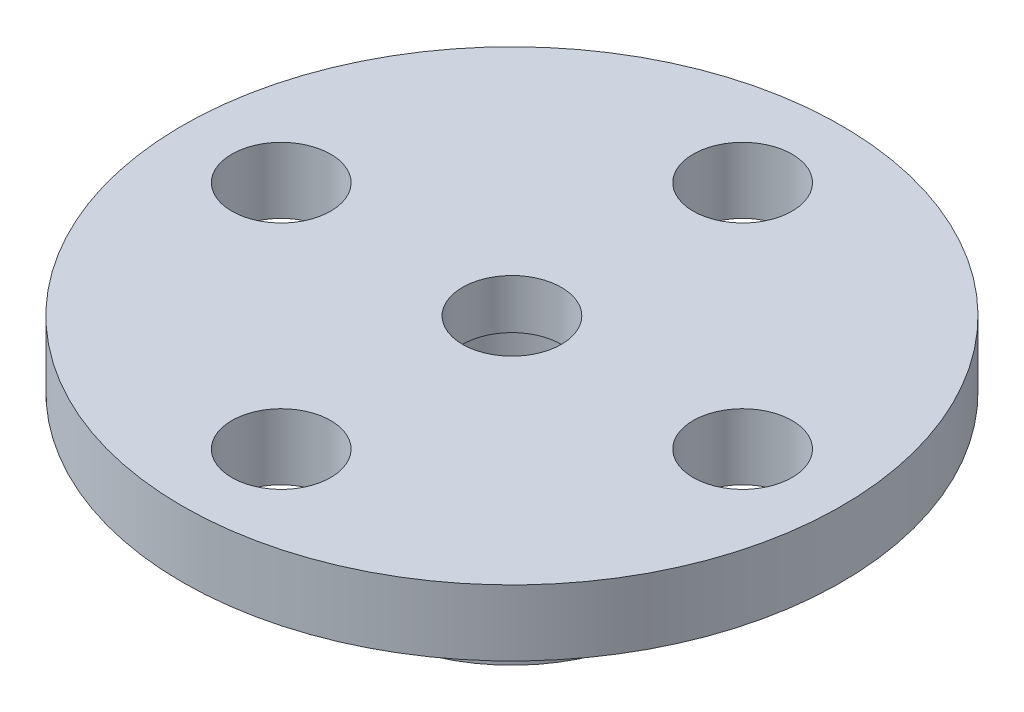
ISO-10303-21;
HEADER;
FILE_DESCRIPTION(('STEP AP214'),'2;1');
FILE_NAME('part.step','',(''),(''),'','','');
FILE_SCHEMA(('AUTOMOTIVE_DESIGN { 1 0 10303 214 1 1 1 1 }'));
ENDSEC;
DATA;
#1=APPLICATION_CONTEXT('core data for automotive mechanical design processes');
#2=APPLICATION_PROTOCOL_DEFINITION('international standard','automotive_design',2000,#1);
#3=PRODUCT_CONTEXT('',#1,'mechanical');
#4=PRODUCT('Part','Part','',(#3));
#5=PRODUCT_RELATED_PRODUCT_CATEGORY('part','',(#4));
#6=PRODUCT_DEFINITION_FORMATION('','',#4);
#7=PRODUCT_DEFINITION_CONTEXT('part definition',#1,'design');
#8=PRODUCT_DEFINITION('design','',#6,#7);
#9=PRODUCT_DEFINITION_SHAPE('','',#8);
#10=(LENGTH_UNIT() NAMED_UNIT(*) SI_UNIT(.MILLI.,.METRE.));
#11=(NAMED_UNIT(*) PLANE_ANGLE_UNIT() SI_UNIT($,.RADIAN.));
#12=(NAMED_UNIT(*) SI_UNIT($,.STERADIAN.) SOLID_ANGLE_UNIT());
#13=UNCERTAINTY_MEASURE_WITH_UNIT(LENGTH_MEASURE(1.E-05),#10,'distance_accuracy_value','');
#14=(GEOMETRIC_REPRESENTATION_CONTEXT(3) GLOBAL_UNCERTAINTY_ASSIGNED_CONTEXT((#13)) GLOBAL_UNIT_ASSIGNED_CONTEXT((#10,
#11,#12)) REPRESENTATION_CONTEXT('',''));
#15=CARTESIAN_POINT('',(0.,0.,0.));
#16=DIRECTION('',(0.,0.,1.));
#17=DIRECTION('',(1.,0.,0.));
#18=AXIS2_PLACEMENT_3D('',#15,#16,#17);
#19=CARTESIAN_POINT('',(0.,2.,0.));
#20=DIRECTION('',(0.,1.,0.));
#21=DIRECTION('',(0.,0.,1.));
#22=AXIS2_PLACEMENT_3D('',#19,#20,#21);
#23=PLANE('',#22);
#24=CARTESIAN_POINT('',(0.,2.,0.));
#25=DIRECTION('',(0.,1.,0.));
#26=DIRECTION('',(0.,0.,1.));
#27=AXIS2_PLACEMENT_3D('',#24,#25,#26);
#28=CIRCLE('',#27,1.5);
#29=CARTESIAN_POINT('',(0.,2.,1.5));
#30=VERTEX_POINT('',#29);
#31=EDGE_CURVE('E76',#30,#30,#28,.T.);
#32=ORIENTED_EDGE('',*,*,#31,.F.);
#33=EDGE_LOOP('',(#32));
#34=FACE_BOUND('',#33,.T.);
#35=CARTESIAN_POINT('',(0.,2.,7.));
#36=DIRECTION('',(0.,1.,0.));
#37=DIRECTION('',(0.,0.,1.));
#38=AXIS2_PLACEMENT_3D('',#35,#36,#37);
#39=CIRCLE('',#38,1.50000000000005);
#40=CARTESIAN_POINT('',(0.,2.,8.50000000000005));
#41=VERTEX_POINT('',#40);
#42=EDGE_CURVE('E58',#41,#41,#39,.T.);
#43=ORIENTED_EDGE('',*,*,#42,.F.);
#44=EDGE_LOOP('',(#43));
#45=FACE_BOUND('',#44,.T.);
#46=CARTESIAN_POINT('',(0.,2.,-7.));
#47=DIRECTION('',(0.,1.,0.));
#48=DIRECTION('',(0.,0.,1.));
#49=AXIS2_PLACEMENT_3D('',#46,#47,#48);
#50=CIRCLE('',#49,1.5);
#51=CARTESIAN_POINT('',(0.,2.,-5.5));
#52=VERTEX_POINT('',#51);
#53=EDGE_CURVE('E47',#52,#52,#50,.T.);
#54=ORIENTED_EDGE('',*,*,#53,.F.);
#55=EDGE_LOOP('',(#54));
#56=FACE_BOUND('',#55,.T.);
#57=CARTESIAN_POINT('',(0.,2.,0.));
#58=DIRECTION('',(0.,1.,0.));
#59=DIRECTION('',(0.,0.,1.));
#60=AXIS2_PLACEMENT_3D('',#57,#58,#59);
#61=CIRCLE('',#60,10.);
#62=CARTESIAN_POINT('',(0.,2.,10.));
#63=VERTEX_POINT('',#62);
#64=EDGE_CURVE('E10',#63,#63,#61,.T.);
#65=ORIENTED_EDGE('',*,*,#64,.T.);
#66=EDGE_LOOP('',(#65));
#67=FACE_BOUND('',#66,.T.);
#68=CARTESIAN_POINT('',(7.,2.,0.));
#69=DIRECTION('',(0.,1.,0.));
#70=DIRECTION('',(0.,0.,1.));
#71=AXIS2_PLACEMENT_3D('',#68,#69,#70);
#72=CIRCLE('',#71,1.50000000000002);
#73=CARTESIAN_POINT('',(7.,2.,1.50000000000002));
#74=VERTEX_POINT('',#73);
#75=EDGE_CURVE('E52',#74,#74,#72,.T.);
#76=ORIENTED_EDGE('',*,*,#75,.F.);
#77=EDGE_LOOP('',(#76));
#78=FACE_BOUND('',#77,.T.);
#79=CARTESIAN_POINT('',(-7.,2.,0.));
#80=DIRECTION('',(0.,1.,0.));
#81=DIRECTION('',(0.,0.,1.));
#82=AXIS2_PLACEMENT_3D('',#79,#80,#81);
#83=CIRCLE('',#82,1.50000000000007);
#84=CARTESIAN_POINT('',(-7.,2.,1.50000000000007));
#85=VERTEX_POINT('',#84);
#86=EDGE_CURVE('E64',#85,#85,#83,.T.);
#87=ORIENTED_EDGE('',*,*,#86,.F.);
#88=EDGE_LOOP('',(#87));
#89=FACE_BOUND('',#88,.T.);
#90=ADVANCED_FACE('F34',(#34,#45,#56,#67,#78,#89),#23,.T.);
#91=CARTESIAN_POINT('',(0.,0.,0.));
#92=DIRECTION('',(0.,1.,0.));
#93=DIRECTION('',(0.,0.,1.));
#94=AXIS2_PLACEMENT_3D('',#91,#92,#93);
#95=PLANE('',#94);
#96=CARTESIAN_POINT('',(0.,0.,0.));
#97=DIRECTION('',(0.,1.,0.));
#98=DIRECTION('',(0.,0.,1.));
#99=AXIS2_PLACEMENT_3D('',#96,#97,#98);
#100=CIRCLE('',#99,4.5);
#101=CARTESIAN_POINT('',(0.,0.,4.5));
#102=VERTEX_POINT('',#101);
#103=EDGE_CURVE('E73',#102,#102,#100,.T.);
#104=ORIENTED_EDGE('',*,*,#103,.T.);
#105=EDGE_LOOP('',(#104));
#106=FACE_BOUND('',#105,.T.);
#107=CARTESIAN_POINT('',(0.,0.,0.));
#108=DIRECTION('',(0.,1.,0.));
#109=DIRECTION('',(0.,0.,1.));
#110=AXIS2_PLACEMENT_3D('',#107,#108,#109);
#111=CIRCLE('',#110,10.);
#112=CARTESIAN_POINT('',(0.,0.,10.));
#113=VERTEX_POINT('',#112);
#114=EDGE_CURVE('E42',#113,#113,#111,.T.);
#115=ORIENTED_EDGE('',*,*,#114,.F.);
#116=EDGE_LOOP('',(#115));
#117=FACE_BOUND('',#116,.T.);
#118=CARTESIAN_POINT('',(0.,0.,-7.));
#119=DIRECTION('',(0.,1.,0.));
#120=DIRECTION('',(0.,0.,1.));
#121=AXIS2_PLACEMENT_3D('',#118,#119,#120);
#122=CIRCLE('',#121,1.5);
#123=CARTESIAN_POINT('',(0.,0.,-5.5));
#124=VERTEX_POINT('',#123);
#125=EDGE_CURVE('E49',#124,#124,#122,.T.);
#126=ORIENTED_EDGE('',*,*,#125,.T.);
#127=EDGE_LOOP('',(#126));
#128=FACE_BOUND('',#127,.T.);
#129=CARTESIAN_POINT('',(7.,0.,0.));
#130=DIRECTION('',(0.,1.,0.));
#131=DIRECTION('',(0.,0.,1.));
#132=AXIS2_PLACEMENT_3D('',#129,#130,#131);
#133=CIRCLE('',#132,1.50000000000002);
#134=CARTESIAN_POINT('',(7.,0.,1.50000000000002));
#135=VERTEX_POINT('',#134);
#136=EDGE_CURVE('E55',#135,#135,#133,.T.);
#137=ORIENTED_EDGE('',*,*,#136,.T.);
#138=EDGE_LOOP('',(#137));
#139=FACE_BOUND('',#138,.T.);
#140=CARTESIAN_POINT('',(0.,0.,7.));
#141=DIRECTION('',(0.,1.,0.));
#142=DIRECTION('',(0.,0.,1.));
#143=AXIS2_PLACEMENT_3D('',#140,#141,#142);
#144=CIRCLE('',#143,1.50000000000005);
#145=CARTESIAN_POINT('',(0.,0.,8.50000000000005));
#146=VERTEX_POINT('',#145);
#147=EDGE_CURVE('E61',#146,#146,#144,.T.);
#148=ORIENTED_EDGE('',*,*,#147,.T.);
#149=EDGE_LOOP('',(#148));
#150=FACE_BOUND('',#149,.T.);
#151=CARTESIAN_POINT('',(-7.,0.,0.));
#152=DIRECTION('',(0.,1.,0.));
#153=DIRECTION('',(0.,0.,1.));
#154=AXIS2_PLACEMENT_3D('',#151,#152,#153);
#155=CIRCLE('',#154,1.50000000000007);
#156=CARTESIAN_POINT('',(-7.,0.,1.50000000000007));
#157=VERTEX_POINT('',#156);
#158=EDGE_CURVE('E67',#157,#157,#155,.T.);
#159=ORIENTED_EDGE('',*,*,#158,.T.);
#160=EDGE_LOOP('',(#159));
#161=FACE_BOUND('',#160,.T.);
#162=ADVANCED_FACE('F107',(#106,#117,#128,#139,#150,#161),#95,.F.);
#163=CARTESIAN_POINT('',(0.,2.,0.));
#164=DIRECTION('',(0.,-1.,0.));
#165=DIRECTION('',(0.,0.,-1.));
#166=AXIS2_PLACEMENT_3D('',#163,#164,#165);
#167=CYLINDRICAL_SURFACE('',#166,10.);
#168=ORIENTED_EDGE('',*,*,#64,.F.);
#169=EDGE_LOOP('',(#168));
#170=FACE_BOUND('',#169,.T.);
#171=ORIENTED_EDGE('',*,*,#114,.T.);
#172=EDGE_LOOP('',(#171));
#173=FACE_BOUND('',#172,.T.);
#174=ADVANCED_FACE('F36',(#170,#173),#167,.T.);
#175=CARTESIAN_POINT('',(0.,2.,-7.));
#176=DIRECTION('',(0.,-1.,0.));
#177=DIRECTION('',(0.,0.,-1.));
#178=AXIS2_PLACEMENT_3D('',#175,#176,#177);
#179=CYLINDRICAL_SURFACE('',#178,1.5);
#180=ORIENTED_EDGE('',*,*,#53,.T.);
#181=EDGE_LOOP('',(#180));
#182=FACE_BOUND('',#181,.T.);
#183=ORIENTED_EDGE('',*,*,#125,.F.);
#184=EDGE_LOOP('',(#183));
#185=FACE_BOUND('',#184,.T.);
#186=ADVANCED_FACE('F117',(#182,#185),#179,.F.);
#187=CARTESIAN_POINT('',(7.,2.,0.));
#188=DIRECTION('',(0.,-1.,0.));
#189=DIRECTION('',(0.,0.,-1.));
#190=AXIS2_PLACEMENT_3D('',#187,#188,#189);
#191=CYLINDRICAL_SURFACE('',#190,1.50000000000002);
#192=ORIENTED_EDGE('',*,*,#75,.T.);
#193=EDGE_LOOP('',(#192));
#194=FACE_BOUND('',#193,.T.);
#195=ORIENTED_EDGE('',*,*,#136,.F.);
#196=EDGE_LOOP('',(#195));
#197=FACE_BOUND('',#196,.T.);
#198=ADVANCED_FACE('F120',(#194,#197),#191,.F.);
#199=CARTESIAN_POINT('',(0.,2.,7.));
#200=DIRECTION('',(0.,-1.,0.));
#201=DIRECTION('',(0.,0.,-1.));
#202=AXIS2_PLACEMENT_3D('',#199,#200,#201);
#203=CYLINDRICAL_SURFACE('',#202,1.50000000000005);
#204=ORIENTED_EDGE('',*,*,#42,.T.);
#205=EDGE_LOOP('',(#204));
#206=FACE_BOUND('',#205,.T.);
#207=ORIENTED_EDGE('',*,*,#147,.F.);
#208=EDGE_LOOP('',(#207));
#209=FACE_BOUND('',#208,.T.);
#210=ADVANCED_FACE('F124',(#206,#209),#203,.F.);
#211=CARTESIAN_POINT('',(-7.,2.,0.));
#212=DIRECTION('',(0.,-1.,0.));
#213=DIRECTION('',(0.,0.,-1.));
#214=AXIS2_PLACEMENT_3D('',#211,#212,#213);
#215=CYLINDRICAL_SURFACE('',#214,1.50000000000007);
#216=ORIENTED_EDGE('',*,*,#86,.T.);
#217=EDGE_LOOP('',(#216));
#218=FACE_BOUND('',#217,.T.);
#219=ORIENTED_EDGE('',*,*,#158,.F.);
#220=EDGE_LOOP('',(#219));
#221=FACE_BOUND('',#220,.T.);
#222=ADVANCED_FACE('F128',(#218,#221),#215,.F.);
#223=CARTESIAN_POINT('',(0.,-4.,0.));
#224=DIRECTION('',(0.,1.,0.));
#225=DIRECTION('',(0.,0.,1.));
#226=AXIS2_PLACEMENT_3D('',#223,#224,#225);
#227=CYLINDRICAL_SURFACE('',#226,4.5);
#228=CARTESIAN_POINT('',(0.,-4.,0.));
#229=DIRECTION('',(0.,1.,0.));
#230=DIRECTION('',(0.,0.,1.));
#231=AXIS2_PLACEMENT_3D('',#228,#229,#230);
#232=CIRCLE('',#231,4.5);
#233=CARTESIAN_POINT('',(0.,-4.,4.5));
#234=VERTEX_POINT('',#233);
#235=EDGE_CURVE('E70',#234,#234,#232,.T.);
#236=ORIENTED_EDGE('',*,*,#235,.T.);
#237=EDGE_LOOP('',(#236));
#238=FACE_BOUND('',#237,.T.);
#239=ORIENTED_EDGE('',*,*,#103,.F.);
#240=EDGE_LOOP('',(#239));
#241=FACE_BOUND('',#240,.T.);
#242=ADVANCED_FACE('F132',(#238,#241),#227,.T.);
#243=CARTESIAN_POINT('',(0.,-4.,0.));
#244=DIRECTION('',(0.,1.,0.));
#245=DIRECTION('',(0.,0.,1.));
#246=AXIS2_PLACEMENT_3D('',#243,#244,#245);
#247=PLANE('',#246);
#248=CARTESIAN_POINT('',(0.,-4.,0.));
#249=DIRECTION('',(0.,1.,0.));
#250=DIRECTION('',(0.,0.,1.));
#251=AXIS2_PLACEMENT_3D('',#248,#249,#250);
#252=CIRCLE('',#251,2.45);
#253=CARTESIAN_POINT('',(0.,-4.,2.45));
#254=VERTEX_POINT('',#253);
#255=EDGE_CURVE('E81',#254,#254,#252,.T.);
#256=ORIENTED_EDGE('',*,*,#255,.T.);
#257=EDGE_LOOP('',(#256));
#258=FACE_BOUND('',#257,.T.);
#259=ORIENTED_EDGE('',*,*,#235,.F.);
#260=EDGE_LOOP('',(#259));
#261=FACE_BOUND('',#260,.T.);
#262=ADVANCED_FACE('F104',(#258,#261),#247,.F.);
#263=CARTESIAN_POINT('',(0.,-4.,0.));
#264=DIRECTION('',(0.,1.,0.));
#265=DIRECTION('',(0.,0.,1.));
#266=AXIS2_PLACEMENT_3D('',#263,#264,#265);
#267=CYLINDRICAL_SURFACE('',#266,1.5);
#268=CARTESIAN_POINT('',(0.,0.5,0.));
#269=DIRECTION('',(0.,1.,0.));
#270=DIRECTION('',(0.,0.,1.));
#271=AXIS2_PLACEMENT_3D('',#268,#269,#270);
#272=CIRCLE('',#271,1.5);
#273=CARTESIAN_POINT('',(0.,0.5,1.5));
#274=VERTEX_POINT('',#273);
#275=EDGE_CURVE('E38',#274,#274,#272,.F.);
#276=ORIENTED_EDGE('',*,*,#275,.T.);
#277=EDGE_LOOP('',(#276));
#278=FACE_BOUND('',#277,.T.);
#279=ORIENTED_EDGE('',*,*,#31,.T.);
#280=EDGE_LOOP('',(#279));
#281=FACE_BOUND('',#280,.T.);
#282=ADVANCED_FACE('F91',(#278,#281),#267,.F.);
#283=CARTESIAN_POINT('',(0.,0.5,0.));
#284=DIRECTION('',(0.,1.,0.));
#285=DIRECTION('',(0.,0.,1.));
#286=AXIS2_PLACEMENT_3D('',#283,#284,#285);
#287=PLANE('',#286);
#288=CARTESIAN_POINT('',(0.,0.5,0.));
#289=DIRECTION('',(0.,1.,0.));
#290=DIRECTION('',(0.,0.,1.));
#291=AXIS2_PLACEMENT_3D('',#288,#289,#290);
#292=CIRCLE('',#291,2.45);
#293=CARTESIAN_POINT('',(0.,0.5,2.45));
#294=VERTEX_POINT('',#293);
#295=EDGE_CURVE('E84',#294,#294,#292,.T.);
#296=ORIENTED_EDGE('',*,*,#295,.F.);
#297=EDGE_LOOP('',(#296));
#298=FACE_BOUND('',#297,.T.);
#299=ORIENTED_EDGE('',*,*,#275,.F.);
#300=EDGE_LOOP('',(#299));
#301=FACE_BOUND('',#300,.T.);
#302=ADVANCED_FACE('F94',(#298,#301),#287,.F.);
#303=CARTESIAN_POINT('',(0.,0.5,0.));
#304=DIRECTION('',(0.,-1.,0.));
#305=DIRECTION('',(0.,0.,-1.));
#306=AXIS2_PLACEMENT_3D('',#303,#304,#305);
#307=CYLINDRICAL_SURFACE('',#306,2.45);
#308=ORIENTED_EDGE('',*,*,#295,.T.);
#309=EDGE_LOOP('',(#308));
#310=FACE_BOUND('',#309,.T.);
#311=ORIENTED_EDGE('',*,*,#255,.F.);
#312=EDGE_LOOP('',(#311));
#313=FACE_BOUND('',#312,.T.);
#314=ADVANCED_FACE('F96',(#310,#313),#307,.F.);
#315=CLOSED_SHELL('',(#90,#162,#174,#186,#198,#210,#222,#242,#262,#282,#302,#314));
#316=MANIFOLD_SOLID_BREP('B2',#315);
#317=ADVANCED_BREP_SHAPE_REPRESENTATION('',(#18,#316),#14);
#318=SHAPE_DEFINITION_REPRESENTATION(#9,#317);
ENDSEC;
END-ISO-10303-21;
